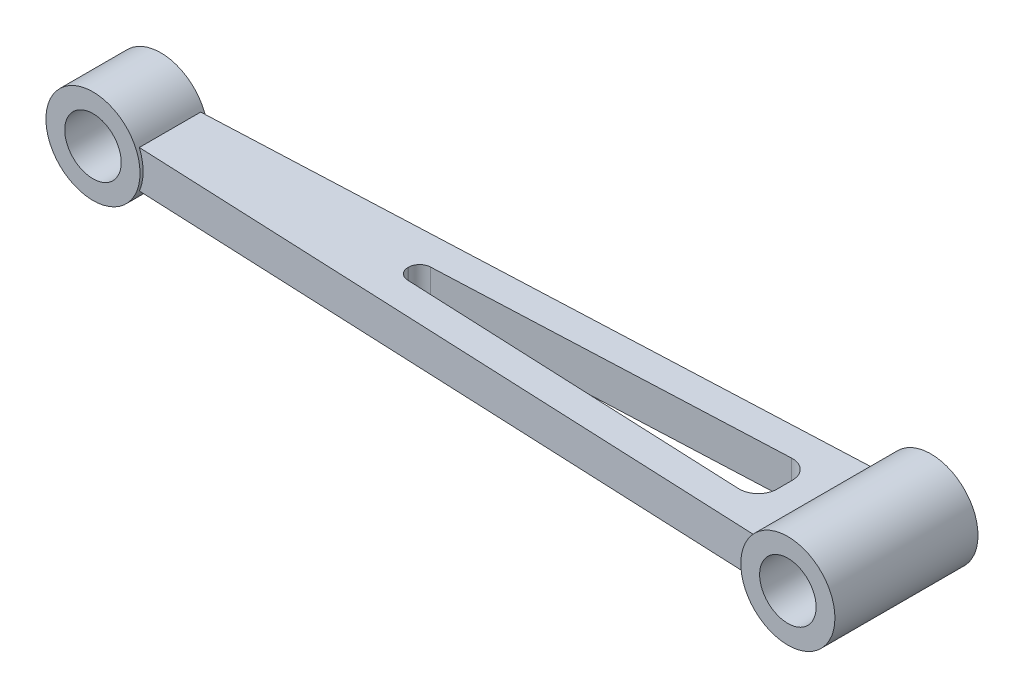
ISO-10303-21;
HEADER;
FILE_DESCRIPTION(('STEP AP214'),'2;1');
FILE_NAME('part.step','',(''),(''),'','','');
FILE_SCHEMA(('AUTOMOTIVE_DESIGN { 1 0 10303 214 1 1 1 1 }'));
ENDSEC;
DATA;
#1=APPLICATION_CONTEXT('core data for automotive mechanical design processes');
#2=APPLICATION_PROTOCOL_DEFINITION('international standard','automotive_design',2000,#1);
#3=PRODUCT_CONTEXT('',#1,'mechanical');
#4=PRODUCT('Part','Part','',(#3));
#5=PRODUCT_RELATED_PRODUCT_CATEGORY('part','',(#4));
#6=PRODUCT_DEFINITION_FORMATION('','',#4);
#7=PRODUCT_DEFINITION_CONTEXT('part definition',#1,'design');
#8=PRODUCT_DEFINITION('design','',#6,#7);
#9=PRODUCT_DEFINITION_SHAPE('','',#8);
#10=(LENGTH_UNIT() NAMED_UNIT(*) SI_UNIT(.MILLI.,.METRE.));
#11=(NAMED_UNIT(*) PLANE_ANGLE_UNIT() SI_UNIT($,.RADIAN.));
#12=(NAMED_UNIT(*) SI_UNIT($,.STERADIAN.) SOLID_ANGLE_UNIT());
#13=UNCERTAINTY_MEASURE_WITH_UNIT(LENGTH_MEASURE(1.E-05),#10,'distance_accuracy_value','');
#14=(GEOMETRIC_REPRESENTATION_CONTEXT(3) GLOBAL_UNCERTAINTY_ASSIGNED_CONTEXT((#13)) GLOBAL_UNIT_ASSIGNED_CONTEXT((#10,
#11,#12)) REPRESENTATION_CONTEXT('',''));
#15=CARTESIAN_POINT('',(0.,0.,0.));
#16=DIRECTION('',(0.,0.,1.));
#17=DIRECTION('',(1.,0.,0.));
#18=AXIS2_PLACEMENT_3D('',#15,#16,#17);
#19=CARTESIAN_POINT('',(0.,5.,0.));
#20=DIRECTION('',(0.,1.,0.));
#21=DIRECTION('',(0.,0.,1.));
#22=AXIS2_PLACEMENT_3D('',#19,#20,#21);
#23=PLANE('',#22);
#24=CARTESIAN_POINT('',(-19.5579842340527,5.,-0.0281247732355767));
#25=DIRECTION('',(0.,1.,0.));
#26=DIRECTION('',(0.,0.,1.));
#27=AXIS2_PLACEMENT_3D('',#24,#25,#26);
#28=CIRCLE('',#27,3.);
#29=CARTESIAN_POINT('',(-19.6888423961487,5.,-3.02526943798115));
#30=VERTEX_POINT('',#29);
#31=CARTESIAN_POINT('',(-22.5579842340527,5.,-0.028124773235555));
#32=VERTEX_POINT('',#31);
#33=EDGE_CURVE('E146',#30,#32,#28,.T.);
#34=ORIENTED_EDGE('',*,*,#33,.F.);
#35=DIRECTION('',(-0.999048221581858,0.,0.0436193873653362));
#36=VECTOR('',#35,1.);
#37=CARTESIAN_POINT('',(-0.169295797210213,5.,-3.87751124763745));
#38=LINE('',#37,#36);
#39=CARTESIAN_POINT('',(72.2239188291206,5.,-7.03826725840135));
#40=VERTEX_POINT('',#39);
#41=EDGE_CURVE('E225',#40,#30,#38,.T.);
#42=ORIENTED_EDGE('',*,*,#41,.F.);
#43=CARTESIAN_POINT('',(72.4420157659473,5.,-2.04302615049206));
#44=DIRECTION('',(0.,1.,0.));
#45=DIRECTION('',(0.,0.,1.));
#46=AXIS2_PLACEMENT_3D('',#43,#44,#45);
#47=CIRCLE('',#46,5.);
#48=CARTESIAN_POINT('',(77.4420157659473,5.,-2.04302615049203));
#49=VERTEX_POINT('',#48);
#50=EDGE_CURVE('E222',#49,#40,#47,.T.);
#51=ORIENTED_EDGE('',*,*,#50,.F.);
#52=DIRECTION('',(0.,0.,-1.));
#53=VECTOR('',#52,1.);
#54=CARTESIAN_POINT('',(77.4420157659473,5.,0.));
#55=LINE('',#54,#53);
#56=CARTESIAN_POINT('',(77.4420157659473,5.,2.04302615049203));
#57=VERTEX_POINT('',#56);
#58=EDGE_CURVE('E219',#57,#49,#55,.T.);
#59=ORIENTED_EDGE('',*,*,#58,.F.);
#60=CARTESIAN_POINT('',(72.4420157659473,5.,2.04302615049207));
#61=DIRECTION('',(0.,1.,0.));
#62=DIRECTION('',(0.,0.,1.));
#63=AXIS2_PLACEMENT_3D('',#60,#61,#62);
#64=CIRCLE('',#63,5.);
#65=CARTESIAN_POINT('',(72.2239188291206,5.,7.03826725840135));
#66=VERTEX_POINT('',#65);
#67=EDGE_CURVE('E216',#66,#57,#64,.T.);
#68=ORIENTED_EDGE('',*,*,#67,.F.);
#69=DIRECTION('',(0.999048221581858,0.,0.0436193873653362));
#70=VECTOR('',#69,1.);
#71=CARTESIAN_POINT('',(-0.169295797210213,5.,3.87751124763745));
#72=LINE('',#71,#70);
#73=CARTESIAN_POINT('',(-19.6888423961487,5.,3.02526943798115));
#74=VERTEX_POINT('',#73);
#75=EDGE_CURVE('E213',#74,#66,#72,.T.);
#76=ORIENTED_EDGE('',*,*,#75,.F.);
#77=CARTESIAN_POINT('',(-19.5579842340527,5.,0.0281247732355759));
#78=DIRECTION('',(0.,1.,0.));
#79=DIRECTION('',(0.,0.,1.));
#80=AXIS2_PLACEMENT_3D('',#77,#78,#79);
#81=CIRCLE('',#80,3.);
#82=CARTESIAN_POINT('',(-22.5579842340527,5.,0.0281247732355602));
#83=VERTEX_POINT('',#82);
#84=EDGE_CURVE('E210',#83,#74,#81,.T.);
#85=ORIENTED_EDGE('',*,*,#84,.F.);
#86=DIRECTION('',(0.,0.,1.));
#87=VECTOR('',#86,1.);
#88=CARTESIAN_POINT('',(-22.5579842340527,5.,0.));
#89=LINE('',#88,#87);
#90=EDGE_CURVE('E186',#32,#83,#89,.T.);
#91=ORIENTED_EDGE('',*,*,#90,.F.);
#92=EDGE_LOOP('',(#34,#42,#51,#59,#68,#76,#85,#91));
#93=FACE_BOUND('',#92,.T.);
#94=DIRECTION('',(0.999048221581858,0.,0.0436193873653362));
#95=VECTOR('',#94,1.);
#96=CARTESIAN_POINT('',(-97.28,5.,7.64518781694058));
#97=LINE('',#96,#95);
#98=CARTESIAN_POINT('',(-85.8235607626104,5.,8.14538675641909));
#99=VERTEX_POINT('',#98);
#100=CARTESIAN_POINT('',(85.8235607626103,5.,15.6396619297422));
#101=VERTEX_POINT('',#100);
#102=EDGE_CURVE('E253',#99,#101,#97,.T.);
#103=ORIENTED_EDGE('',*,*,#102,.T.);
#104=DIRECTION('',(0.,0.,-1.));
#105=VECTOR('',#104,1.);
#106=CARTESIAN_POINT('',(85.8235607626104,5.,19.));
#107=LINE('',#106,#105);
#108=CARTESIAN_POINT('',(85.8235607626102,5.,-15.6396619297422));
#109=VERTEX_POINT('',#108);
#110=EDGE_CURVE('E242',#101,#109,#107,.T.);
#111=ORIENTED_EDGE('',*,*,#110,.T.);
#112=DIRECTION('',(-0.999048221581858,0.,0.0436193873653362));
#113=VECTOR('',#112,1.);
#114=CARTESIAN_POINT('',(-97.28,5.,-7.64518781694058));
#115=LINE('',#114,#113);
#116=CARTESIAN_POINT('',(-85.8235607626104,5.,-8.14538675641909));
#117=VERTEX_POINT('',#116);
#118=EDGE_CURVE('E250',#109,#117,#115,.T.);
#119=ORIENTED_EDGE('',*,*,#118,.T.);
#120=DIRECTION('',(0.,0.,-1.));
#121=VECTOR('',#120,1.);
#122=CARTESIAN_POINT('',(-85.8235607626104,5.,9.));
#123=LINE('',#122,#121);
#124=EDGE_CURVE('E282',#99,#117,#123,.T.);
#125=ORIENTED_EDGE('',*,*,#124,.F.);
#126=EDGE_LOOP('',(#103,#111,#119,#125));
#127=FACE_BOUND('',#126,.T.);
#128=ADVANCED_FACE('F44',(#93,#127),#23,.T.);
#129=CARTESIAN_POINT('',(0.,-5.,0.));
#130=DIRECTION('',(0.,1.,0.));
#131=DIRECTION('',(0.,0.,1.));
#132=AXIS2_PLACEMENT_3D('',#129,#130,#131);
#133=PLANE('',#132);
#134=DIRECTION('',(-0.999048221581858,0.,0.0436193873653362));
#135=VECTOR('',#134,1.);
#136=CARTESIAN_POINT('',(-0.169295797210213,-5.,-3.87751124763745));
#137=LINE('',#136,#135);
#138=CARTESIAN_POINT('',(72.2239188291206,-5.,-7.03826725840135));
#139=VERTEX_POINT('',#138);
#140=CARTESIAN_POINT('',(-19.6888423961487,-5.,-3.02526943798115));
#141=VERTEX_POINT('',#140);
#142=EDGE_CURVE('E54',#139,#141,#137,.T.);
#143=ORIENTED_EDGE('',*,*,#142,.T.);
#144=CARTESIAN_POINT('',(-19.5579842340527,-5.,-0.0281247732355767));
#145=DIRECTION('',(0.,1.,0.));
#146=DIRECTION('',(0.,0.,1.));
#147=AXIS2_PLACEMENT_3D('',#144,#145,#146);
#148=CIRCLE('',#147,3.);
#149=CARTESIAN_POINT('',(-22.5579842340527,-5.,-0.028124773235555));
#150=VERTEX_POINT('',#149);
#151=EDGE_CURVE('E11',#141,#150,#148,.T.);
#152=ORIENTED_EDGE('',*,*,#151,.T.);
#153=DIRECTION('',(0.,0.,1.));
#154=VECTOR('',#153,1.);
#155=CARTESIAN_POINT('',(-22.5579842340527,-5.,0.));
#156=LINE('',#155,#154);
#157=CARTESIAN_POINT('',(-22.5579842340527,-5.,0.0281247732355602));
#158=VERTEX_POINT('',#157);
#159=EDGE_CURVE('E133',#150,#158,#156,.T.);
#160=ORIENTED_EDGE('',*,*,#159,.T.);
#161=CARTESIAN_POINT('',(-19.5579842340527,-5.,0.0281247732355759));
#162=DIRECTION('',(0.,1.,0.));
#163=DIRECTION('',(0.,0.,1.));
#164=AXIS2_PLACEMENT_3D('',#161,#162,#163);
#165=CIRCLE('',#164,3.);
#166=CARTESIAN_POINT('',(-19.6888423961487,-5.,3.02526943798115));
#167=VERTEX_POINT('',#166);
#168=EDGE_CURVE('E138',#158,#167,#165,.T.);
#169=ORIENTED_EDGE('',*,*,#168,.T.);
#170=DIRECTION('',(0.999048221581858,0.,0.0436193873653362));
#171=VECTOR('',#170,1.);
#172=CARTESIAN_POINT('',(-0.169295797210213,-5.,3.87751124763745));
#173=LINE('',#172,#171);
#174=CARTESIAN_POINT('',(72.2239188291206,-5.,7.03826725840135));
#175=VERTEX_POINT('',#174);
#176=EDGE_CURVE('E291',#167,#175,#173,.T.);
#177=ORIENTED_EDGE('',*,*,#176,.T.);
#178=CARTESIAN_POINT('',(72.4420157659473,-5.,2.04302615049207));
#179=DIRECTION('',(0.,1.,0.));
#180=DIRECTION('',(0.,0.,1.));
#181=AXIS2_PLACEMENT_3D('',#178,#179,#180);
#182=CIRCLE('',#181,5.);
#183=CARTESIAN_POINT('',(77.4420157659473,-5.,2.04302615049203));
#184=VERTEX_POINT('',#183);
#185=EDGE_CURVE('E295',#175,#184,#182,.T.);
#186=ORIENTED_EDGE('',*,*,#185,.T.);
#187=DIRECTION('',(0.,0.,-1.));
#188=VECTOR('',#187,1.);
#189=CARTESIAN_POINT('',(77.4420157659473,-5.,0.));
#190=LINE('',#189,#188);
#191=CARTESIAN_POINT('',(77.4420157659473,-5.,-2.04302615049203));
#192=VERTEX_POINT('',#191);
#193=EDGE_CURVE('E163',#184,#192,#190,.T.);
#194=ORIENTED_EDGE('',*,*,#193,.T.);
#195=CARTESIAN_POINT('',(72.4420157659473,-5.,-2.04302615049206));
#196=DIRECTION('',(0.,1.,0.));
#197=DIRECTION('',(0.,0.,1.));
#198=AXIS2_PLACEMENT_3D('',#195,#196,#197);
#199=CIRCLE('',#198,5.);
#200=EDGE_CURVE('E156',#192,#139,#199,.T.);
#201=ORIENTED_EDGE('',*,*,#200,.T.);
#202=EDGE_LOOP('',(#143,#152,#160,#169,#177,#186,#194,#201));
#203=FACE_BOUND('',#202,.T.);
#204=DIRECTION('',(0.,0.,-1.));
#205=VECTOR('',#204,1.);
#206=CARTESIAN_POINT('',(85.8235607626104,-5.,19.));
#207=LINE('',#206,#205);
#208=CARTESIAN_POINT('',(85.8235607626103,-5.,15.6396619297422));
#209=VERTEX_POINT('',#208);
#210=CARTESIAN_POINT('',(85.8235607626102,-5.,-15.6396619297422));
#211=VERTEX_POINT('',#210);
#212=EDGE_CURVE('E235',#209,#211,#207,.T.);
#213=ORIENTED_EDGE('',*,*,#212,.F.);
#214=DIRECTION('',(0.999048221581858,0.,0.0436193873653362));
#215=VECTOR('',#214,1.);
#216=CARTESIAN_POINT('',(-97.28,-5.,7.64518781694058));
#217=LINE('',#216,#215);
#218=CARTESIAN_POINT('',(-85.8235607626104,-5.,8.14538675641909));
#219=VERTEX_POINT('',#218);
#220=EDGE_CURVE('E254',#219,#209,#217,.T.);
#221=ORIENTED_EDGE('',*,*,#220,.F.);
#222=DIRECTION('',(0.,0.,-1.));
#223=VECTOR('',#222,1.);
#224=CARTESIAN_POINT('',(-85.8235607626104,-5.,9.));
#225=LINE('',#224,#223);
#226=CARTESIAN_POINT('',(-85.8235607626104,-5.,-8.14538675641909));
#227=VERTEX_POINT('',#226);
#228=EDGE_CURVE('E267',#219,#227,#225,.T.);
#229=ORIENTED_EDGE('',*,*,#228,.T.);
#230=DIRECTION('',(-0.999048221581858,0.,0.0436193873653362));
#231=VECTOR('',#230,1.);
#232=CARTESIAN_POINT('',(-97.28,-5.,-7.64518781694058));
#233=LINE('',#232,#231);
#234=EDGE_CURVE('E249',#211,#227,#233,.T.);
#235=ORIENTED_EDGE('',*,*,#234,.F.);
#236=EDGE_LOOP('',(#213,#221,#229,#235));
#237=FACE_BOUND('',#236,.T.);
#238=ADVANCED_FACE('F152',(#203,#237),#133,.F.);
#239=CARTESIAN_POINT('',(-97.28,0.,9.));
#240=DIRECTION('',(0.,0.,-1.));
#241=DIRECTION('',(-1.,0.,0.));
#242=AXIS2_PLACEMENT_3D('',#239,#240,#241);
#243=CYLINDRICAL_SURFACE('',#242,12.5);
#244=CARTESIAN_POINT('',(-97.28,0.,7.64518781694058));
#245=DIRECTION('',(0.0436193873653362,0.,-0.999048221581858));
#246=DIRECTION('',(-0.999048221581858,0.,-0.0436193873653362));
#247=AXIS2_PLACEMENT_3D('',#244,#245,#246);
#248=ELLIPSE('',#247,12.5119085645415,12.5);
#249=EDGE_CURVE('E274',#99,#219,#248,.T.);
#250=ORIENTED_EDGE('',*,*,#249,.F.);
#251=ORIENTED_EDGE('',*,*,#124,.T.);
#252=CARTESIAN_POINT('',(-97.28,0.,-7.64518781694058));
#253=DIRECTION('',(0.0436193873653362,0.,0.999048221581858));
#254=DIRECTION('',(0.999048221581858,0.,-0.0436193873653362));
#255=AXIS2_PLACEMENT_3D('',#252,#253,#254);
#256=ELLIPSE('',#255,12.5119085645415,12.5);
#257=EDGE_CURVE('E278',#227,#117,#256,.T.);
#258=ORIENTED_EDGE('',*,*,#257,.F.);
#259=ORIENTED_EDGE('',*,*,#228,.F.);
#260=EDGE_LOOP('',(#250,#251,#258,#259));
#261=FACE_BOUND('',#260,.T.);
#262=CARTESIAN_POINT('',(-97.28,0.,9.));
#263=DIRECTION('',(0.,0.,1.));
#264=DIRECTION('',(1.,0.,0.));
#265=AXIS2_PLACEMENT_3D('',#262,#263,#264);
#266=CIRCLE('',#265,12.5);
#267=CARTESIAN_POINT('',(-84.78,0.,9.));
#268=VERTEX_POINT('',#267);
#269=EDGE_CURVE('E263',#268,#268,#266,.T.);
#270=ORIENTED_EDGE('',*,*,#269,.F.);
#271=EDGE_LOOP('',(#270));
#272=FACE_BOUND('',#271,.T.);
#273=CARTESIAN_POINT('',(-97.28,0.,-9.));
#274=DIRECTION('',(0.,0.,1.));
#275=DIRECTION('',(1.,0.,0.));
#276=AXIS2_PLACEMENT_3D('',#273,#274,#275);
#277=CIRCLE('',#276,12.5);
#278=CARTESIAN_POINT('',(-84.78,0.,-9.));
#279=VERTEX_POINT('',#278);
#280=EDGE_CURVE('E258',#279,#279,#277,.T.);
#281=ORIENTED_EDGE('',*,*,#280,.T.);
#282=EDGE_LOOP('',(#281));
#283=FACE_BOUND('',#282,.T.);
#284=ADVANCED_FACE('F46',(#261,#272,#283),#243,.T.);
#285=CARTESIAN_POINT('',(-97.28,0.,9.));
#286=DIRECTION('',(0.,0.,1.));
#287=DIRECTION('',(1.,0.,0.));
#288=AXIS2_PLACEMENT_3D('',#285,#286,#287);
#289=PLANE('',#288);
#290=CARTESIAN_POINT('',(-97.28,0.,9.));
#291=DIRECTION('',(0.,0.,1.));
#292=DIRECTION('',(1.,0.,0.));
#293=AXIS2_PLACEMENT_3D('',#290,#291,#292);
#294=CIRCLE('',#293,7.5);
#295=CARTESIAN_POINT('',(-89.78,0.,9.));
#296=VERTEX_POINT('',#295);
#297=EDGE_CURVE('E149',#296,#296,#294,.T.);
#298=ORIENTED_EDGE('',*,*,#297,.F.);
#299=EDGE_LOOP('',(#298));
#300=FACE_BOUND('',#299,.T.);
#301=ORIENTED_EDGE('',*,*,#269,.T.);
#302=EDGE_LOOP('',(#301));
#303=FACE_BOUND('',#302,.T.);
#304=ADVANCED_FACE('F350',(#300,#303),#289,.T.);
#305=CARTESIAN_POINT('',(-97.28,0.,-9.));
#306=DIRECTION('',(0.,0.,1.));
#307=DIRECTION('',(1.,0.,0.));
#308=AXIS2_PLACEMENT_3D('',#305,#306,#307);
#309=PLANE('',#308);
#310=CARTESIAN_POINT('',(-97.28,0.,-9.));
#311=DIRECTION('',(0.,0.,1.));
#312=DIRECTION('',(1.,0.,0.));
#313=AXIS2_PLACEMENT_3D('',#310,#311,#312);
#314=CIRCLE('',#313,7.5);
#315=CARTESIAN_POINT('',(-89.78,0.,-9.));
#316=VERTEX_POINT('',#315);
#317=EDGE_CURVE('E48',#316,#316,#314,.T.);
#318=ORIENTED_EDGE('',*,*,#317,.T.);
#319=EDGE_LOOP('',(#318));
#320=FACE_BOUND('',#319,.T.);
#321=ORIENTED_EDGE('',*,*,#280,.F.);
#322=EDGE_LOOP('',(#321));
#323=FACE_BOUND('',#322,.T.);
#324=ADVANCED_FACE('F348',(#320,#323),#309,.F.);
#325=CARTESIAN_POINT('',(-97.28,5.,-7.64518781694058));
#326=DIRECTION('',(0.0436193873653362,0.,0.999048221581858));
#327=DIRECTION('',(0.999048221581858,0.,-0.0436193873653362));
#328=AXIS2_PLACEMENT_3D('',#325,#326,#327);
#329=PLANE('',#328);
#330=CARTESIAN_POINT('',(97.28,0.,-16.1398608692207));
#331=DIRECTION('',(0.0436193873653362,0.,0.999048221581858));
#332=DIRECTION('',(0.999048221581858,0.,-0.0436193873653362));
#333=AXIS2_PLACEMENT_3D('',#330,#331,#332);
#334=ELLIPSE('',#333,12.5119085645415,12.5);
#335=EDGE_CURVE('E245',#211,#109,#334,.F.);
#336=ORIENTED_EDGE('',*,*,#335,.F.);
#337=ORIENTED_EDGE('',*,*,#234,.T.);
#338=ORIENTED_EDGE('',*,*,#257,.T.);
#339=ORIENTED_EDGE('',*,*,#118,.F.);
#340=EDGE_LOOP('',(#336,#337,#338,#339));
#341=FACE_BOUND('',#340,.T.);
#342=ADVANCED_FACE('F344',(#341),#329,.F.);
#343=CARTESIAN_POINT('',(-97.28,5.,7.64518781694058));
#344=DIRECTION('',(0.0436193873653362,0.,-0.999048221581858));
#345=DIRECTION('',(-0.999048221581858,0.,-0.0436193873653362));
#346=AXIS2_PLACEMENT_3D('',#343,#344,#345);
#347=PLANE('',#346);
#348=CARTESIAN_POINT('',(97.28,0.,16.1398608692207));
#349=DIRECTION('',(0.0436193873653362,0.,-0.999048221581858));
#350=DIRECTION('',(-0.999048221581858,0.,-0.0436193873653362));
#351=AXIS2_PLACEMENT_3D('',#348,#349,#350);
#352=ELLIPSE('',#351,12.5119085645415,12.5);
#353=EDGE_CURVE('E139',#101,#209,#352,.F.);
#354=ORIENTED_EDGE('',*,*,#353,.F.);
#355=ORIENTED_EDGE('',*,*,#102,.F.);
#356=ORIENTED_EDGE('',*,*,#249,.T.);
#357=ORIENTED_EDGE('',*,*,#220,.T.);
#358=EDGE_LOOP('',(#354,#355,#356,#357));
#359=FACE_BOUND('',#358,.T.);
#360=ADVANCED_FACE('F341',(#359),#347,.F.);
#361=CARTESIAN_POINT('',(97.28,0.,19.));
#362=DIRECTION('',(0.,0.,-1.));
#363=DIRECTION('',(-1.,0.,0.));
#364=AXIS2_PLACEMENT_3D('',#361,#362,#363);
#365=CYLINDRICAL_SURFACE('',#364,12.5);
#366=CARTESIAN_POINT('',(97.28,0.,19.));
#367=DIRECTION('',(0.,0.,1.));
#368=DIRECTION('',(1.,0.,0.));
#369=AXIS2_PLACEMENT_3D('',#366,#367,#368);
#370=CIRCLE('',#369,12.5);
#371=CARTESIAN_POINT('',(109.78,0.,19.));
#372=VERTEX_POINT('',#371);
#373=EDGE_CURVE('E231',#372,#372,#370,.T.);
#374=ORIENTED_EDGE('',*,*,#373,.F.);
#375=EDGE_LOOP('',(#374));
#376=FACE_BOUND('',#375,.T.);
#377=CARTESIAN_POINT('',(97.28,0.,-19.));
#378=DIRECTION('',(0.,0.,1.));
#379=DIRECTION('',(1.,0.,0.));
#380=AXIS2_PLACEMENT_3D('',#377,#378,#379);
#381=CIRCLE('',#380,12.5);
#382=CARTESIAN_POINT('',(109.78,0.,-19.));
#383=VERTEX_POINT('',#382);
#384=EDGE_CURVE('E230',#383,#383,#381,.T.);
#385=ORIENTED_EDGE('',*,*,#384,.T.);
#386=EDGE_LOOP('',(#385));
#387=FACE_BOUND('',#386,.T.);
#388=ORIENTED_EDGE('',*,*,#212,.T.);
#389=ORIENTED_EDGE('',*,*,#335,.T.);
#390=ORIENTED_EDGE('',*,*,#110,.F.);
#391=ORIENTED_EDGE('',*,*,#353,.T.);
#392=EDGE_LOOP('',(#388,#389,#390,#391));
#393=FACE_BOUND('',#392,.T.);
#394=ADVANCED_FACE('F338',(#376,#387,#393),#365,.T.);
#395=CARTESIAN_POINT('',(97.28,0.,19.));
#396=DIRECTION('',(0.,0.,1.));
#397=DIRECTION('',(1.,0.,0.));
#398=AXIS2_PLACEMENT_3D('',#395,#396,#397);
#399=PLANE('',#398);
#400=CARTESIAN_POINT('',(97.28,0.,19.));
#401=DIRECTION('',(0.,0.,1.));
#402=DIRECTION('',(1.,0.,0.));
#403=AXIS2_PLACEMENT_3D('',#400,#401,#402);
#404=CIRCLE('',#403,7.50000000000001);
#405=CARTESIAN_POINT('',(104.78,0.,19.));
#406=VERTEX_POINT('',#405);
#407=EDGE_CURVE('E169',#406,#406,#404,.T.);
#408=ORIENTED_EDGE('',*,*,#407,.F.);
#409=EDGE_LOOP('',(#408));
#410=FACE_BOUND('',#409,.T.);
#411=ORIENTED_EDGE('',*,*,#373,.T.);
#412=EDGE_LOOP('',(#411));
#413=FACE_BOUND('',#412,.T.);
#414=ADVANCED_FACE('F378',(#410,#413),#399,.T.);
#415=CARTESIAN_POINT('',(97.28,0.,-19.));
#416=DIRECTION('',(0.,0.,1.));
#417=DIRECTION('',(1.,0.,0.));
#418=AXIS2_PLACEMENT_3D('',#415,#416,#417);
#419=PLANE('',#418);
#420=CARTESIAN_POINT('',(97.28,0.,-19.));
#421=DIRECTION('',(0.,0.,1.));
#422=DIRECTION('',(1.,0.,0.));
#423=AXIS2_PLACEMENT_3D('',#420,#421,#422);
#424=CIRCLE('',#423,7.50000000000001);
#425=CARTESIAN_POINT('',(104.78,0.,-19.));
#426=VERTEX_POINT('',#425);
#427=EDGE_CURVE('E166',#426,#426,#424,.T.);
#428=ORIENTED_EDGE('',*,*,#427,.T.);
#429=EDGE_LOOP('',(#428));
#430=FACE_BOUND('',#429,.T.);
#431=ORIENTED_EDGE('',*,*,#384,.F.);
#432=EDGE_LOOP('',(#431));
#433=FACE_BOUND('',#432,.T.);
#434=ADVANCED_FACE('F382',(#430,#433),#419,.F.);
#435=CARTESIAN_POINT('',(-19.5579842340527,-21.5,-0.0281247732355767));
#436=DIRECTION('',(0.,1.,0.));
#437=DIRECTION('',(0.,0.,1.));
#438=AXIS2_PLACEMENT_3D('',#435,#436,#437);
#439=CYLINDRICAL_SURFACE('',#438,3.);
#440=ORIENTED_EDGE('',*,*,#33,.T.);
#441=DIRECTION('',(0.,1.,0.));
#442=VECTOR('',#441,1.);
#443=CARTESIAN_POINT('',(-22.5579842340527,-21.5,-0.028124773235555));
#444=LINE('',#443,#442);
#445=EDGE_CURVE('E62',#150,#32,#444,.T.);
#446=ORIENTED_EDGE('',*,*,#445,.F.);
#447=ORIENTED_EDGE('',*,*,#151,.F.);
#448=DIRECTION('',(0.,1.,0.));
#449=VECTOR('',#448,1.);
#450=CARTESIAN_POINT('',(-19.6888423961487,-21.5,-3.02526943798115));
#451=LINE('',#450,#449);
#452=EDGE_CURVE('E183',#141,#30,#451,.T.);
#453=ORIENTED_EDGE('',*,*,#452,.T.);
#454=EDGE_LOOP('',(#440,#446,#447,#453));
#455=FACE_BOUND('',#454,.T.);
#456=ADVANCED_FACE('F142',(#455),#439,.F.);
#457=CARTESIAN_POINT('',(72.2239188291206,-21.5,-7.03826725840135));
#458=DIRECTION('',(-0.0436193873653362,0.,-0.999048221581858));
#459=DIRECTION('',(-0.999048221581858,0.,0.0436193873653362));
#460=AXIS2_PLACEMENT_3D('',#457,#458,#459);
#461=PLANE('',#460);
#462=ORIENTED_EDGE('',*,*,#41,.T.);
#463=ORIENTED_EDGE('',*,*,#452,.F.);
#464=ORIENTED_EDGE('',*,*,#142,.F.);
#465=DIRECTION('',(0.,1.,0.));
#466=VECTOR('',#465,1.);
#467=CARTESIAN_POINT('',(72.2239188291206,-21.5,-7.03826725840135));
#468=LINE('',#467,#466);
#469=EDGE_CURVE('E187',#139,#40,#468,.T.);
#470=ORIENTED_EDGE('',*,*,#469,.T.);
#471=EDGE_LOOP('',(#462,#463,#464,#470));
#472=FACE_BOUND('',#471,.T.);
#473=ADVANCED_FACE('F316',(#472),#461,.F.);
#474=CARTESIAN_POINT('',(72.4420157659473,-21.5,-2.04302615049206));
#475=DIRECTION('',(0.,1.,0.));
#476=DIRECTION('',(0.,0.,1.));
#477=AXIS2_PLACEMENT_3D('',#474,#475,#476);
#478=CYLINDRICAL_SURFACE('',#477,5.);
#479=ORIENTED_EDGE('',*,*,#50,.T.);
#480=ORIENTED_EDGE('',*,*,#469,.F.);
#481=ORIENTED_EDGE('',*,*,#200,.F.);
#482=DIRECTION('',(0.,1.,0.));
#483=VECTOR('',#482,1.);
#484=CARTESIAN_POINT('',(77.4420157659473,-21.5,-2.04302615049203));
#485=LINE('',#484,#483);
#486=EDGE_CURVE('E190',#192,#49,#485,.T.);
#487=ORIENTED_EDGE('',*,*,#486,.T.);
#488=EDGE_LOOP('',(#479,#480,#481,#487));
#489=FACE_BOUND('',#488,.T.);
#490=ADVANCED_FACE('F315',(#489),#478,.F.);
#491=CARTESIAN_POINT('',(77.4420157659473,-21.5,-2.04302615049203));
#492=DIRECTION('',(1.,0.,0.));
#493=DIRECTION('',(0.,0.,-1.));
#494=AXIS2_PLACEMENT_3D('',#491,#492,#493);
#495=PLANE('',#494);
#496=ORIENTED_EDGE('',*,*,#58,.T.);
#497=ORIENTED_EDGE('',*,*,#486,.F.);
#498=ORIENTED_EDGE('',*,*,#193,.F.);
#499=DIRECTION('',(0.,1.,0.));
#500=VECTOR('',#499,1.);
#501=CARTESIAN_POINT('',(77.4420157659473,-21.5,2.04302615049203));
#502=LINE('',#501,#500);
#503=EDGE_CURVE('E194',#184,#57,#502,.T.);
#504=ORIENTED_EDGE('',*,*,#503,.T.);
#505=EDGE_LOOP('',(#496,#497,#498,#504));
#506=FACE_BOUND('',#505,.T.);
#507=ADVANCED_FACE('F302',(#506),#495,.F.);
#508=CARTESIAN_POINT('',(72.4420157659473,-21.5,2.04302615049207));
#509=DIRECTION('',(0.,1.,0.));
#510=DIRECTION('',(0.,0.,1.));
#511=AXIS2_PLACEMENT_3D('',#508,#509,#510);
#512=CYLINDRICAL_SURFACE('',#511,5.);
#513=ORIENTED_EDGE('',*,*,#67,.T.);
#514=ORIENTED_EDGE('',*,*,#503,.F.);
#515=ORIENTED_EDGE('',*,*,#185,.F.);
#516=DIRECTION('',(0.,1.,0.));
#517=VECTOR('',#516,1.);
#518=CARTESIAN_POINT('',(72.2239188291206,-21.5,7.03826725840135));
#519=LINE('',#518,#517);
#520=EDGE_CURVE('E198',#175,#66,#519,.T.);
#521=ORIENTED_EDGE('',*,*,#520,.T.);
#522=EDGE_LOOP('',(#513,#514,#515,#521));
#523=FACE_BOUND('',#522,.T.);
#524=ADVANCED_FACE('F305',(#523),#512,.F.);
#525=CARTESIAN_POINT('',(-19.6888423961487,-21.5,3.02526943798115));
#526=DIRECTION('',(-0.0436193873653362,0.,0.999048221581858));
#527=DIRECTION('',(0.999048221581858,0.,0.0436193873653362));
#528=AXIS2_PLACEMENT_3D('',#525,#526,#527);
#529=PLANE('',#528);
#530=ORIENTED_EDGE('',*,*,#75,.T.);
#531=ORIENTED_EDGE('',*,*,#520,.F.);
#532=ORIENTED_EDGE('',*,*,#176,.F.);
#533=DIRECTION('',(0.,1.,0.));
#534=VECTOR('',#533,1.);
#535=CARTESIAN_POINT('',(-19.6888423961487,-21.5,3.02526943798115));
#536=LINE('',#535,#534);
#537=EDGE_CURVE('E202',#167,#74,#536,.T.);
#538=ORIENTED_EDGE('',*,*,#537,.T.);
#539=EDGE_LOOP('',(#530,#531,#532,#538));
#540=FACE_BOUND('',#539,.T.);
#541=ADVANCED_FACE('F321',(#540),#529,.F.);
#542=CARTESIAN_POINT('',(-19.5579842340527,-21.5,0.0281247732355759));
#543=DIRECTION('',(0.,1.,0.));
#544=DIRECTION('',(0.,0.,1.));
#545=AXIS2_PLACEMENT_3D('',#542,#543,#544);
#546=CYLINDRICAL_SURFACE('',#545,3.);
#547=ORIENTED_EDGE('',*,*,#84,.T.);
#548=ORIENTED_EDGE('',*,*,#537,.F.);
#549=ORIENTED_EDGE('',*,*,#168,.F.);
#550=DIRECTION('',(0.,1.,0.));
#551=VECTOR('',#550,1.);
#552=CARTESIAN_POINT('',(-22.5579842340527,-21.5,0.0281247732355602));
#553=LINE('',#552,#551);
#554=EDGE_CURVE('E67',#158,#83,#553,.T.);
#555=ORIENTED_EDGE('',*,*,#554,.T.);
#556=EDGE_LOOP('',(#547,#548,#549,#555));
#557=FACE_BOUND('',#556,.T.);
#558=ADVANCED_FACE('F318',(#557),#546,.F.);
#559=CARTESIAN_POINT('',(-22.5579842340527,-21.5,-0.028124773235555));
#560=DIRECTION('',(-1.,0.,0.));
#561=DIRECTION('',(0.,0.,1.));
#562=AXIS2_PLACEMENT_3D('',#559,#560,#561);
#563=PLANE('',#562);
#564=ORIENTED_EDGE('',*,*,#90,.T.);
#565=ORIENTED_EDGE('',*,*,#554,.F.);
#566=ORIENTED_EDGE('',*,*,#159,.F.);
#567=ORIENTED_EDGE('',*,*,#445,.T.);
#568=EDGE_LOOP('',(#564,#565,#566,#567));
#569=FACE_BOUND('',#568,.T.);
#570=ADVANCED_FACE('F134',(#569),#563,.F.);
#571=CARTESIAN_POINT('',(97.28,0.,-26.5));
#572=DIRECTION('',(0.,0.,1.));
#573=DIRECTION('',(1.,0.,0.));
#574=AXIS2_PLACEMENT_3D('',#571,#572,#573);
#575=CYLINDRICAL_SURFACE('',#574,7.50000000000001);
#576=ORIENTED_EDGE('',*,*,#407,.T.);
#577=EDGE_LOOP('',(#576));
#578=FACE_BOUND('',#577,.T.);
#579=ORIENTED_EDGE('',*,*,#427,.F.);
#580=EDGE_LOOP('',(#579));
#581=FACE_BOUND('',#580,.T.);
#582=ADVANCED_FACE('F397',(#578,#581),#575,.F.);
#583=CARTESIAN_POINT('',(-97.28,0.,-26.5));
#584=DIRECTION('',(0.,0.,1.));
#585=DIRECTION('',(1.,0.,0.));
#586=AXIS2_PLACEMENT_3D('',#583,#584,#585);
#587=CYLINDRICAL_SURFACE('',#586,7.5);
#588=ORIENTED_EDGE('',*,*,#297,.T.);
#589=EDGE_LOOP('',(#588));
#590=FACE_BOUND('',#589,.T.);
#591=ORIENTED_EDGE('',*,*,#317,.F.);
#592=EDGE_LOOP('',(#591));
#593=FACE_BOUND('',#592,.T.);
#594=ADVANCED_FACE('F400',(#590,#593),#587,.F.);
#595=CLOSED_SHELL('',(#128,#238,#284,#304,#324,#342,#360,#394,#414,#434,#456,#473,#490,#507,
#524,#541,#558,#570,#582,#594));
#596=MANIFOLD_SOLID_BREP('B2',#595);
#597=ADVANCED_BREP_SHAPE_REPRESENTATION('',(#18,#596),#14);
#598=SHAPE_DEFINITION_REPRESENTATION(#9,#597);
ENDSEC;
END-ISO-10303-21;
